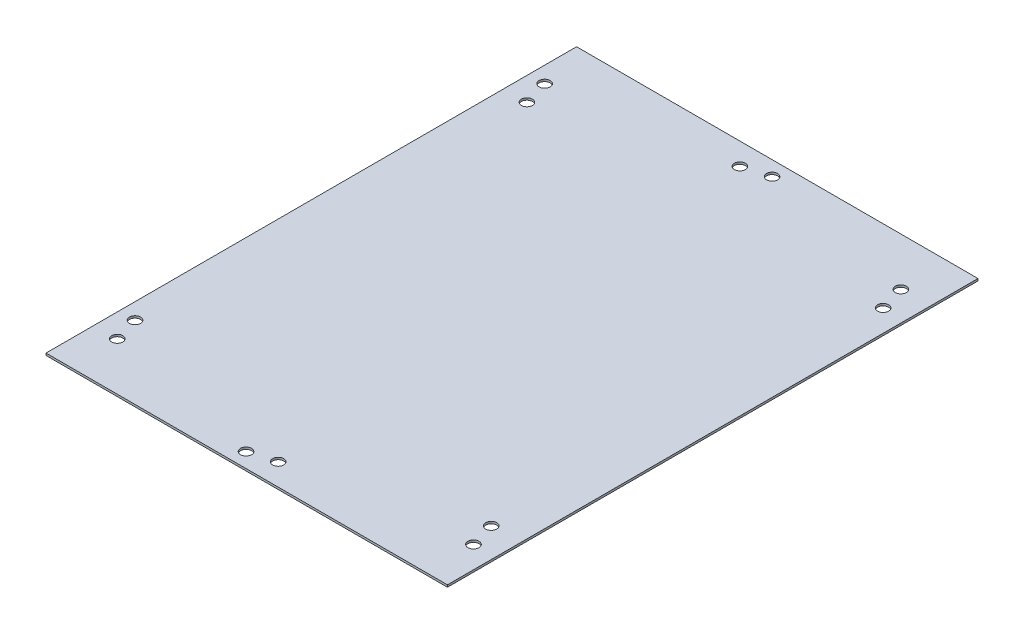
ISO-10303-21;
HEADER;
FILE_DESCRIPTION(('STEP AP214'),'2;1');
FILE_NAME('part.step','',(''),(''),'','','');
FILE_SCHEMA(('AUTOMOTIVE_DESIGN { 1 0 10303 214 1 1 1 1 }'));
ENDSEC;
DATA;
#1=APPLICATION_CONTEXT('core data for automotive mechanical design processes');
#2=APPLICATION_PROTOCOL_DEFINITION('international standard','automotive_design',2000,#1);
#3=PRODUCT_CONTEXT('',#1,'mechanical');
#4=PRODUCT('Part','Part','',(#3));
#5=PRODUCT_RELATED_PRODUCT_CATEGORY('part','',(#4));
#6=PRODUCT_DEFINITION_FORMATION('','',#4);
#7=PRODUCT_DEFINITION_CONTEXT('part definition',#1,'design');
#8=PRODUCT_DEFINITION('design','',#6,#7);
#9=PRODUCT_DEFINITION_SHAPE('','',#8);
#10=(LENGTH_UNIT() NAMED_UNIT(*) SI_UNIT(.MILLI.,.METRE.));
#11=(NAMED_UNIT(*) PLANE_ANGLE_UNIT() SI_UNIT($,.RADIAN.));
#12=(NAMED_UNIT(*) SI_UNIT($,.STERADIAN.) SOLID_ANGLE_UNIT());
#13=UNCERTAINTY_MEASURE_WITH_UNIT(LENGTH_MEASURE(1.E-05),#10,'distance_accuracy_value','');
#14=(GEOMETRIC_REPRESENTATION_CONTEXT(3) GLOBAL_UNCERTAINTY_ASSIGNED_CONTEXT((#13)) GLOBAL_UNIT_ASSIGNED_CONTEXT((#10,
#11,#12)) REPRESENTATION_CONTEXT('',''));
#15=CARTESIAN_POINT('',(0.,0.,0.));
#16=DIRECTION('',(0.,0.,1.));
#17=DIRECTION('',(1.,0.,0.));
#18=AXIS2_PLACEMENT_3D('',#15,#16,#17);
#19=CARTESIAN_POINT('',(122.5,1.2954,-161.9));
#20=DIRECTION('',(-1.,0.,0.));
#21=DIRECTION('',(0.,0.,1.));
#22=AXIS2_PLACEMENT_3D('',#19,#20,#21);
#23=PLANE('',#22);
#24=DIRECTION('',(0.,0.,-1.));
#25=VECTOR('',#24,1.);
#26=CARTESIAN_POINT('',(122.5,0.,-161.9));
#27=LINE('',#26,#25);
#28=CARTESIAN_POINT('',(122.5,0.,161.9));
#29=VERTEX_POINT('',#28);
#30=CARTESIAN_POINT('',(122.5,0.,-161.9));
#31=VERTEX_POINT('',#30);
#32=EDGE_CURVE('E96',#29,#31,#27,.T.);
#33=ORIENTED_EDGE('',*,*,#32,.T.);
#34=DIRECTION('',(0.,-1.,0.));
#35=VECTOR('',#34,1.);
#36=CARTESIAN_POINT('',(122.5,1.2954,-161.9));
#37=LINE('',#36,#35);
#38=CARTESIAN_POINT('',(122.5,1.2954,-161.9));
#39=VERTEX_POINT('',#38);
#40=EDGE_CURVE('E11',#39,#31,#37,.T.);
#41=ORIENTED_EDGE('',*,*,#40,.F.);
#42=DIRECTION('',(0.,0.,-1.));
#43=VECTOR('',#42,1.);
#44=CARTESIAN_POINT('',(122.5,1.2954,-161.9));
#45=LINE('',#44,#43);
#46=CARTESIAN_POINT('',(122.5,1.2954,161.9));
#47=VERTEX_POINT('',#46);
#48=EDGE_CURVE('E84',#47,#39,#45,.T.);
#49=ORIENTED_EDGE('',*,*,#48,.F.);
#50=DIRECTION('',(0.,-1.,0.));
#51=VECTOR('',#50,1.);
#52=CARTESIAN_POINT('',(122.5,1.2954,161.9));
#53=LINE('',#52,#51);
#54=EDGE_CURVE('E92',#47,#29,#53,.T.);
#55=ORIENTED_EDGE('',*,*,#54,.T.);
#56=EDGE_LOOP('',(#33,#41,#49,#55));
#57=FACE_BOUND('',#56,.T.);
#58=ADVANCED_FACE('F33',(#57),#23,.F.);
#59=CARTESIAN_POINT('',(-122.5,1.2954,-161.9));
#60=DIRECTION('',(0.,0.,1.));
#61=DIRECTION('',(1.,0.,0.));
#62=AXIS2_PLACEMENT_3D('',#59,#60,#61);
#63=PLANE('',#62);
#64=DIRECTION('',(-1.,0.,0.));
#65=VECTOR('',#64,1.);
#66=CARTESIAN_POINT('',(-122.5,0.,-161.9));
#67=LINE('',#66,#65);
#68=CARTESIAN_POINT('',(-122.5,0.,-161.9));
#69=VERTEX_POINT('',#68);
#70=EDGE_CURVE('E88',#31,#69,#67,.T.);
#71=ORIENTED_EDGE('',*,*,#70,.T.);
#72=DIRECTION('',(0.,-1.,0.));
#73=VECTOR('',#72,1.);
#74=CARTESIAN_POINT('',(-122.5,1.2954,-161.9));
#75=LINE('',#74,#73);
#76=CARTESIAN_POINT('',(-122.5,1.2954,-161.9));
#77=VERTEX_POINT('',#76);
#78=EDGE_CURVE('E41',#77,#69,#75,.T.);
#79=ORIENTED_EDGE('',*,*,#78,.F.);
#80=DIRECTION('',(-1.,0.,0.));
#81=VECTOR('',#80,1.);
#82=CARTESIAN_POINT('',(-122.5,1.2954,-161.9));
#83=LINE('',#82,#81);
#84=EDGE_CURVE('E79',#39,#77,#83,.T.);
#85=ORIENTED_EDGE('',*,*,#84,.F.);
#86=ORIENTED_EDGE('',*,*,#40,.T.);
#87=EDGE_LOOP('',(#71,#79,#85,#86));
#88=FACE_BOUND('',#87,.T.);
#89=ADVANCED_FACE('F87',(#88),#63,.F.);
#90=CARTESIAN_POINT('',(-122.5,1.2954,-161.9));
#91=DIRECTION('',(1.,0.,0.));
#92=DIRECTION('',(0.,0.,-1.));
#93=AXIS2_PLACEMENT_3D('',#90,#91,#92);
#94=PLANE('',#93);
#95=DIRECTION('',(0.,0.,1.));
#96=VECTOR('',#95,1.);
#97=CARTESIAN_POINT('',(-122.5,0.,-161.9));
#98=LINE('',#97,#96);
#99=CARTESIAN_POINT('',(-122.5,0.,161.9));
#100=VERTEX_POINT('',#99);
#101=EDGE_CURVE('E66',#69,#100,#98,.T.);
#102=ORIENTED_EDGE('',*,*,#101,.T.);
#103=DIRECTION('',(0.,-1.,0.));
#104=VECTOR('',#103,1.);
#105=CARTESIAN_POINT('',(-122.5,1.2954,161.9));
#106=LINE('',#105,#104);
#107=CARTESIAN_POINT('',(-122.5,1.2954,161.9));
#108=VERTEX_POINT('',#107);
#109=EDGE_CURVE('E89',#108,#100,#106,.T.);
#110=ORIENTED_EDGE('',*,*,#109,.F.);
#111=DIRECTION('',(0.,0.,1.));
#112=VECTOR('',#111,1.);
#113=CARTESIAN_POINT('',(-122.5,1.2954,-161.9));
#114=LINE('',#113,#112);
#115=EDGE_CURVE('E82',#77,#108,#114,.T.);
#116=ORIENTED_EDGE('',*,*,#115,.F.);
#117=ORIENTED_EDGE('',*,*,#78,.T.);
#118=EDGE_LOOP('',(#102,#110,#116,#117));
#119=FACE_BOUND('',#118,.T.);
#120=ADVANCED_FACE('F90',(#119),#94,.F.);
#121=CARTESIAN_POINT('',(-122.5,1.2954,161.9));
#122=DIRECTION('',(0.,0.,-1.));
#123=DIRECTION('',(-1.,0.,0.));
#124=AXIS2_PLACEMENT_3D('',#121,#122,#123);
#125=PLANE('',#124);
#126=DIRECTION('',(1.,0.,0.));
#127=VECTOR('',#126,1.);
#128=CARTESIAN_POINT('',(-122.5,0.,161.9));
#129=LINE('',#128,#127);
#130=EDGE_CURVE('E72',#100,#29,#129,.T.);
#131=ORIENTED_EDGE('',*,*,#130,.T.);
#132=ORIENTED_EDGE('',*,*,#54,.F.);
#133=DIRECTION('',(1.,0.,0.));
#134=VECTOR('',#133,1.);
#135=CARTESIAN_POINT('',(-122.5,1.2954,161.9));
#136=LINE('',#135,#134);
#137=EDGE_CURVE('E49',#108,#47,#136,.T.);
#138=ORIENTED_EDGE('',*,*,#137,.F.);
#139=ORIENTED_EDGE('',*,*,#109,.T.);
#140=EDGE_LOOP('',(#131,#132,#138,#139));
#141=FACE_BOUND('',#140,.T.);
#142=ADVANCED_FACE('F104',(#141),#125,.F.);
#143=CARTESIAN_POINT('',(0.,1.2954,0.));
#144=DIRECTION('',(0.,1.,0.));
#145=DIRECTION('',(0.,0.,1.));
#146=AXIS2_PLACEMENT_3D('',#143,#144,#145);
#147=PLANE('',#146);
#148=CARTESIAN_POINT('',(-108.2954,1.2954,-117.379999999997));
#149=DIRECTION('',(0.,1.,0.));
#150=DIRECTION('',(0.,0.,1.));
#151=AXIS2_PLACEMENT_3D('',#148,#149,#150);
#152=CIRCLE('',#151,3.37819999999998);
#153=CARTESIAN_POINT('',(-108.2954,1.2954,-114.001799999997));
#154=VERTEX_POINT('',#153);
#155=EDGE_CURVE('E144',#154,#154,#152,.T.);
#156=ORIENTED_EDGE('',*,*,#155,.F.);
#157=EDGE_LOOP('',(#156));
#158=FACE_BOUND('',#157,.T.);
#159=CARTESIAN_POINT('',(-9.41540000000002,1.2954,-148.500000000001));
#160=DIRECTION('',(0.,1.,0.));
#161=DIRECTION('',(0.,0.,1.));
#162=AXIS2_PLACEMENT_3D('',#159,#160,#161);
#163=CIRCLE('',#162,3.37819999999999);
#164=CARTESIAN_POINT('',(-9.41540000000002,1.2954,-145.121800000001));
#165=VERTEX_POINT('',#164);
#166=EDGE_CURVE('E143',#165,#165,#163,.T.);
#167=ORIENTED_EDGE('',*,*,#166,.F.);
#168=EDGE_LOOP('',(#167));
#169=FACE_BOUND('',#168,.T.);
#170=CARTESIAN_POINT('',(5.82459999999998,1.2954,-152.900000000001));
#171=DIRECTION('',(0.,1.,0.));
#172=DIRECTION('',(0.,0.,1.));
#173=AXIS2_PLACEMENT_3D('',#170,#171,#172);
#174=CIRCLE('',#173,3.37819999999999);
#175=CARTESIAN_POINT('',(5.82459999999998,1.2954,-149.521800000001));
#176=VERTEX_POINT('',#175);
#177=EDGE_CURVE('E151',#176,#176,#174,.T.);
#178=ORIENTED_EDGE('',*,*,#177,.F.);
#179=EDGE_LOOP('',(#178));
#180=FACE_BOUND('',#179,.T.);
#181=CARTESIAN_POINT('',(104.7046,1.2954,-132.619999999997));
#182=DIRECTION('',(0.,1.,0.));
#183=DIRECTION('',(0.,0.,1.));
#184=AXIS2_PLACEMENT_3D('',#181,#182,#183);
#185=CIRCLE('',#184,3.37819999999998);
#186=CARTESIAN_POINT('',(104.7046,1.2954,-129.241799999997));
#187=VERTEX_POINT('',#186);
#188=EDGE_CURVE('E157',#187,#187,#185,.T.);
#189=ORIENTED_EDGE('',*,*,#188,.F.);
#190=EDGE_LOOP('',(#189));
#191=FACE_BOUND('',#190,.T.);
#192=CARTESIAN_POINT('',(104.7046,1.2954,117.380000000003));
#193=DIRECTION('',(0.,1.,0.));
#194=DIRECTION('',(0.,0.,1.));
#195=AXIS2_PLACEMENT_3D('',#192,#193,#194);
#196=CIRCLE('',#195,3.37820000000001);
#197=CARTESIAN_POINT('',(104.7046,1.2954,120.758200000003));
#198=VERTEX_POINT('',#197);
#199=EDGE_CURVE('E119',#198,#198,#196,.T.);
#200=ORIENTED_EDGE('',*,*,#199,.F.);
#201=EDGE_LOOP('',(#200));
#202=FACE_BOUND('',#201,.T.);
#203=CARTESIAN_POINT('',(5.82459999999997,1.2954,148.499999999999));
#204=DIRECTION('',(0.,1.,0.));
#205=DIRECTION('',(0.,0.,1.));
#206=AXIS2_PLACEMENT_3D('',#203,#204,#205);
#207=CIRCLE('',#206,3.37819999999998);
#208=CARTESIAN_POINT('',(5.82459999999997,1.2954,151.878199999999));
#209=VERTEX_POINT('',#208);
#210=EDGE_CURVE('E120',#209,#209,#207,.T.);
#211=ORIENTED_EDGE('',*,*,#210,.F.);
#212=EDGE_LOOP('',(#211));
#213=FACE_BOUND('',#212,.T.);
#214=CARTESIAN_POINT('',(-9.41540000000003,1.2954,152.899999999999));
#215=DIRECTION('',(0.,1.,0.));
#216=DIRECTION('',(0.,0.,1.));
#217=AXIS2_PLACEMENT_3D('',#214,#215,#216);
#218=CIRCLE('',#217,3.37819999999999);
#219=CARTESIAN_POINT('',(-9.41540000000003,1.2954,156.278199999999));
#220=VERTEX_POINT('',#219);
#221=EDGE_CURVE('E131',#220,#220,#218,.T.);
#222=ORIENTED_EDGE('',*,*,#221,.F.);
#223=EDGE_LOOP('',(#222));
#224=FACE_BOUND('',#223,.T.);
#225=CARTESIAN_POINT('',(109.1046,1.2954,-117.379999999997));
#226=DIRECTION('',(0.,1.,0.));
#227=DIRECTION('',(0.,0.,1.));
#228=AXIS2_PLACEMENT_3D('',#225,#226,#227);
#229=CIRCLE('',#228,3.37819999999998);
#230=CARTESIAN_POINT('',(109.1046,1.2954,-114.001799999997));
#231=VERTEX_POINT('',#230);
#232=EDGE_CURVE('E132',#231,#231,#229,.T.);
#233=ORIENTED_EDGE('',*,*,#232,.F.);
#234=EDGE_LOOP('',(#233));
#235=FACE_BOUND('',#234,.T.);
#236=CARTESIAN_POINT('',(-112.6954,1.2954,117.380000000003));
#237=DIRECTION('',(0.,1.,0.));
#238=DIRECTION('',(0.,0.,1.));
#239=AXIS2_PLACEMENT_3D('',#236,#237,#238);
#240=CIRCLE('',#239,3.37819999999999);
#241=CARTESIAN_POINT('',(-112.6954,1.2954,120.758200000003));
#242=VERTEX_POINT('',#241);
#243=EDGE_CURVE('E178',#242,#242,#240,.T.);
#244=ORIENTED_EDGE('',*,*,#243,.F.);
#245=EDGE_LOOP('',(#244));
#246=FACE_BOUND('',#245,.T.);
#247=CARTESIAN_POINT('',(-108.2954,1.2954,132.620000000003));
#248=DIRECTION('',(0.,1.,0.));
#249=DIRECTION('',(0.,0.,1.));
#250=AXIS2_PLACEMENT_3D('',#247,#248,#249);
#251=CIRCLE('',#250,3.37819999999995);
#252=CARTESIAN_POINT('',(-108.2954,1.2954,135.998200000003));
#253=VERTEX_POINT('',#252);
#254=EDGE_CURVE('E168',#253,#253,#251,.T.);
#255=ORIENTED_EDGE('',*,*,#254,.F.);
#256=EDGE_LOOP('',(#255));
#257=FACE_BOUND('',#256,.T.);
#258=CARTESIAN_POINT('',(-112.6954,1.2954,-132.619999999997));
#259=DIRECTION('',(0.,1.,0.));
#260=DIRECTION('',(0.,0.,1.));
#261=AXIS2_PLACEMENT_3D('',#258,#259,#260);
#262=CIRCLE('',#261,3.37819999999998);
#263=CARTESIAN_POINT('',(-112.6954,1.2954,-129.241799999997));
#264=VERTEX_POINT('',#263);
#265=EDGE_CURVE('E167',#264,#264,#262,.T.);
#266=ORIENTED_EDGE('',*,*,#265,.F.);
#267=EDGE_LOOP('',(#266));
#268=FACE_BOUND('',#267,.T.);
#269=CARTESIAN_POINT('',(109.1046,1.2954,132.620000000003));
#270=DIRECTION('',(0.,1.,0.));
#271=DIRECTION('',(0.,0.,1.));
#272=AXIS2_PLACEMENT_3D('',#269,#270,#271);
#273=CIRCLE('',#272,3.37819999999999);
#274=CARTESIAN_POINT('',(109.1046,1.2954,135.998200000003));
#275=VERTEX_POINT('',#274);
#276=EDGE_CURVE('E112',#275,#275,#273,.T.);
#277=ORIENTED_EDGE('',*,*,#276,.F.);
#278=EDGE_LOOP('',(#277));
#279=FACE_BOUND('',#278,.T.);
#280=ORIENTED_EDGE('',*,*,#48,.T.);
#281=ORIENTED_EDGE('',*,*,#84,.T.);
#282=ORIENTED_EDGE('',*,*,#115,.T.);
#283=ORIENTED_EDGE('',*,*,#137,.T.);
#284=EDGE_LOOP('',(#280,#281,#282,#283));
#285=FACE_BOUND('',#284,.T.);
#286=ADVANCED_FACE('F80',(#158,#169,#180,#191,#202,#213,#224,#235,#246,#257,#268,#279,#285),
#147,.T.);
#287=CARTESIAN_POINT('',(0.,0.,0.));
#288=DIRECTION('',(0.,1.,0.));
#289=DIRECTION('',(0.,0.,1.));
#290=AXIS2_PLACEMENT_3D('',#287,#288,#289);
#291=PLANE('',#290);
#292=CARTESIAN_POINT('',(-108.2954,0.,-117.379999999997));
#293=DIRECTION('',(0.,1.,0.));
#294=DIRECTION('',(0.,0.,1.));
#295=AXIS2_PLACEMENT_3D('',#292,#293,#294);
#296=CIRCLE('',#295,3.37819999999998);
#297=CARTESIAN_POINT('',(-108.2954,0.,-114.001799999997));
#298=VERTEX_POINT('',#297);
#299=EDGE_CURVE('E140',#298,#298,#296,.F.);
#300=ORIENTED_EDGE('',*,*,#299,.F.);
#301=EDGE_LOOP('',(#300));
#302=FACE_BOUND('',#301,.T.);
#303=CARTESIAN_POINT('',(-9.41540000000002,0.,-148.500000000001));
#304=DIRECTION('',(0.,1.,0.));
#305=DIRECTION('',(0.,0.,1.));
#306=AXIS2_PLACEMENT_3D('',#303,#304,#305);
#307=CIRCLE('',#306,3.37819999999999);
#308=CARTESIAN_POINT('',(-9.41540000000002,0.,-145.121800000001));
#309=VERTEX_POINT('',#308);
#310=EDGE_CURVE('E148',#309,#309,#307,.F.);
#311=ORIENTED_EDGE('',*,*,#310,.F.);
#312=EDGE_LOOP('',(#311));
#313=FACE_BOUND('',#312,.T.);
#314=CARTESIAN_POINT('',(5.82459999999998,0.,-152.900000000001));
#315=DIRECTION('',(0.,1.,0.));
#316=DIRECTION('',(0.,0.,1.));
#317=AXIS2_PLACEMENT_3D('',#314,#315,#316);
#318=CIRCLE('',#317,3.37819999999999);
#319=CARTESIAN_POINT('',(5.82459999999998,0.,-149.521800000001));
#320=VERTEX_POINT('',#319);
#321=EDGE_CURVE('E154',#320,#320,#318,.F.);
#322=ORIENTED_EDGE('',*,*,#321,.F.);
#323=EDGE_LOOP('',(#322));
#324=FACE_BOUND('',#323,.T.);
#325=CARTESIAN_POINT('',(104.7046,0.,-132.619999999997));
#326=DIRECTION('',(0.,1.,0.));
#327=DIRECTION('',(0.,0.,1.));
#328=AXIS2_PLACEMENT_3D('',#325,#326,#327);
#329=CIRCLE('',#328,3.37819999999998);
#330=CARTESIAN_POINT('',(104.7046,0.,-129.241799999997));
#331=VERTEX_POINT('',#330);
#332=EDGE_CURVE('E135',#331,#331,#329,.F.);
#333=ORIENTED_EDGE('',*,*,#332,.F.);
#334=EDGE_LOOP('',(#333));
#335=FACE_BOUND('',#334,.T.);
#336=CARTESIAN_POINT('',(104.7046,0.,117.380000000003));
#337=DIRECTION('',(0.,1.,0.));
#338=DIRECTION('',(0.,0.,1.));
#339=AXIS2_PLACEMENT_3D('',#336,#337,#338);
#340=CIRCLE('',#339,3.37820000000001);
#341=CARTESIAN_POINT('',(104.7046,0.,120.758200000003));
#342=VERTEX_POINT('',#341);
#343=EDGE_CURVE('E115',#342,#342,#340,.F.);
#344=ORIENTED_EDGE('',*,*,#343,.F.);
#345=EDGE_LOOP('',(#344));
#346=FACE_BOUND('',#345,.T.);
#347=CARTESIAN_POINT('',(5.82459999999997,0.,148.499999999999));
#348=DIRECTION('',(0.,1.,0.));
#349=DIRECTION('',(0.,0.,1.));
#350=AXIS2_PLACEMENT_3D('',#347,#348,#349);
#351=CIRCLE('',#350,3.37819999999998);
#352=CARTESIAN_POINT('',(5.82459999999997,0.,151.878199999999));
#353=VERTEX_POINT('',#352);
#354=EDGE_CURVE('E116',#353,#353,#351,.F.);
#355=ORIENTED_EDGE('',*,*,#354,.F.);
#356=EDGE_LOOP('',(#355));
#357=FACE_BOUND('',#356,.T.);
#358=CARTESIAN_POINT('',(-9.41540000000003,0.,152.899999999999));
#359=DIRECTION('',(0.,1.,0.));
#360=DIRECTION('',(0.,0.,1.));
#361=AXIS2_PLACEMENT_3D('',#358,#359,#360);
#362=CIRCLE('',#361,3.37819999999999);
#363=CARTESIAN_POINT('',(-9.41540000000003,0.,156.278199999999));
#364=VERTEX_POINT('',#363);
#365=EDGE_CURVE('E123',#364,#364,#362,.F.);
#366=ORIENTED_EDGE('',*,*,#365,.F.);
#367=EDGE_LOOP('',(#366));
#368=FACE_BOUND('',#367,.T.);
#369=CARTESIAN_POINT('',(109.1046,0.,-117.379999999997));
#370=DIRECTION('',(0.,1.,0.));
#371=DIRECTION('',(0.,0.,1.));
#372=AXIS2_PLACEMENT_3D('',#369,#370,#371);
#373=CIRCLE('',#372,3.37819999999998);
#374=CARTESIAN_POINT('',(109.1046,0.,-114.001799999997));
#375=VERTEX_POINT('',#374);
#376=EDGE_CURVE('E128',#375,#375,#373,.F.);
#377=ORIENTED_EDGE('',*,*,#376,.F.);
#378=EDGE_LOOP('',(#377));
#379=FACE_BOUND('',#378,.T.);
#380=CARTESIAN_POINT('',(-112.6954,0.,117.380000000003));
#381=DIRECTION('',(0.,1.,0.));
#382=DIRECTION('',(0.,0.,1.));
#383=AXIS2_PLACEMENT_3D('',#380,#381,#382);
#384=CIRCLE('',#383,3.37819999999999);
#385=CARTESIAN_POINT('',(-112.6954,0.,120.758200000003));
#386=VERTEX_POINT('',#385);
#387=EDGE_CURVE('E171',#386,#386,#384,.F.);
#388=ORIENTED_EDGE('',*,*,#387,.F.);
#389=EDGE_LOOP('',(#388));
#390=FACE_BOUND('',#389,.T.);
#391=CARTESIAN_POINT('',(-108.2954,0.,132.620000000003));
#392=DIRECTION('',(0.,1.,0.));
#393=DIRECTION('',(0.,0.,1.));
#394=AXIS2_PLACEMENT_3D('',#391,#392,#393);
#395=CIRCLE('',#394,3.37819999999995);
#396=CARTESIAN_POINT('',(-108.2954,0.,135.998200000003));
#397=VERTEX_POINT('',#396);
#398=EDGE_CURVE('E164',#397,#397,#395,.F.);
#399=ORIENTED_EDGE('',*,*,#398,.F.);
#400=EDGE_LOOP('',(#399));
#401=FACE_BOUND('',#400,.T.);
#402=CARTESIAN_POINT('',(-112.6954,0.,-132.619999999997));
#403=DIRECTION('',(0.,1.,0.));
#404=DIRECTION('',(0.,0.,1.));
#405=AXIS2_PLACEMENT_3D('',#402,#403,#404);
#406=CIRCLE('',#405,3.37819999999998);
#407=CARTESIAN_POINT('',(-112.6954,0.,-129.241799999997));
#408=VERTEX_POINT('',#407);
#409=EDGE_CURVE('E147',#408,#408,#406,.F.);
#410=ORIENTED_EDGE('',*,*,#409,.F.);
#411=EDGE_LOOP('',(#410));
#412=FACE_BOUND('',#411,.T.);
#413=CARTESIAN_POINT('',(109.1046,0.,132.620000000003));
#414=DIRECTION('',(0.,1.,0.));
#415=DIRECTION('',(0.,0.,1.));
#416=AXIS2_PLACEMENT_3D('',#413,#414,#415);
#417=CIRCLE('',#416,3.37819999999999);
#418=CARTESIAN_POINT('',(109.1046,0.,135.998200000003));
#419=VERTEX_POINT('',#418);
#420=EDGE_CURVE('E99',#419,#419,#417,.F.);
#421=ORIENTED_EDGE('',*,*,#420,.F.);
#422=EDGE_LOOP('',(#421));
#423=FACE_BOUND('',#422,.T.);
#424=ORIENTED_EDGE('',*,*,#32,.F.);
#425=ORIENTED_EDGE('',*,*,#130,.F.);
#426=ORIENTED_EDGE('',*,*,#101,.F.);
#427=ORIENTED_EDGE('',*,*,#70,.F.);
#428=EDGE_LOOP('',(#424,#425,#426,#427));
#429=FACE_BOUND('',#428,.T.);
#430=ADVANCED_FACE('F107',(#302,#313,#324,#335,#346,#357,#368,#379,#390,#401,#412,#423,#429),
#291,.F.);
#431=CARTESIAN_POINT('',(109.1046,-0.000999999999999916,132.620000000003));
#432=DIRECTION('',(0.,1.,0.));
#433=DIRECTION('',(0.,0.,1.));
#434=AXIS2_PLACEMENT_3D('',#431,#432,#433);
#435=CYLINDRICAL_SURFACE('',#434,3.37819999999999);
#436=ORIENTED_EDGE('',*,*,#276,.T.);
#437=EDGE_LOOP('',(#436));
#438=FACE_BOUND('',#437,.T.);
#439=ORIENTED_EDGE('',*,*,#420,.T.);
#440=EDGE_LOOP('',(#439));
#441=FACE_BOUND('',#440,.T.);
#442=ADVANCED_FACE('F195',(#438,#441),#435,.F.);
#443=CARTESIAN_POINT('',(-112.6954,-0.000999999999999916,-132.619999999997));
#444=DIRECTION('',(0.,1.,0.));
#445=DIRECTION('',(0.,0.,1.));
#446=AXIS2_PLACEMENT_3D('',#443,#444,#445);
#447=CYLINDRICAL_SURFACE('',#446,3.37819999999998);
#448=ORIENTED_EDGE('',*,*,#265,.T.);
#449=EDGE_LOOP('',(#448));
#450=FACE_BOUND('',#449,.T.);
#451=ORIENTED_EDGE('',*,*,#409,.T.);
#452=EDGE_LOOP('',(#451));
#453=FACE_BOUND('',#452,.T.);
#454=ADVANCED_FACE('F198',(#450,#453),#447,.F.);
#455=CARTESIAN_POINT('',(-108.2954,-0.000999999999999916,132.620000000003));
#456=DIRECTION('',(0.,1.,0.));
#457=DIRECTION('',(0.,0.,1.));
#458=AXIS2_PLACEMENT_3D('',#455,#456,#457);
#459=CYLINDRICAL_SURFACE('',#458,3.37819999999995);
#460=ORIENTED_EDGE('',*,*,#254,.T.);
#461=EDGE_LOOP('',(#460));
#462=FACE_BOUND('',#461,.T.);
#463=ORIENTED_EDGE('',*,*,#398,.T.);
#464=EDGE_LOOP('',(#463));
#465=FACE_BOUND('',#464,.T.);
#466=ADVANCED_FACE('F243',(#462,#465),#459,.F.);
#467=CARTESIAN_POINT('',(-112.6954,-0.000999999999999916,117.380000000003));
#468=DIRECTION('',(0.,1.,0.));
#469=DIRECTION('',(0.,0.,1.));
#470=AXIS2_PLACEMENT_3D('',#467,#468,#469);
#471=CYLINDRICAL_SURFACE('',#470,3.37819999999999);
#472=ORIENTED_EDGE('',*,*,#243,.T.);
#473=EDGE_LOOP('',(#472));
#474=FACE_BOUND('',#473,.T.);
#475=ORIENTED_EDGE('',*,*,#387,.T.);
#476=EDGE_LOOP('',(#475));
#477=FACE_BOUND('',#476,.T.);
#478=ADVANCED_FACE('F182',(#474,#477),#471,.F.);
#479=CARTESIAN_POINT('',(109.1046,-0.000999999999999916,-117.379999999997));
#480=DIRECTION('',(0.,1.,0.));
#481=DIRECTION('',(0.,0.,1.));
#482=AXIS2_PLACEMENT_3D('',#479,#480,#481);
#483=CYLINDRICAL_SURFACE('',#482,3.37819999999998);
#484=ORIENTED_EDGE('',*,*,#232,.T.);
#485=EDGE_LOOP('',(#484));
#486=FACE_BOUND('',#485,.T.);
#487=ORIENTED_EDGE('',*,*,#376,.T.);
#488=EDGE_LOOP('',(#487));
#489=FACE_BOUND('',#488,.T.);
#490=ADVANCED_FACE('F258',(#486,#489),#483,.F.);
#491=CARTESIAN_POINT('',(-9.41540000000003,-0.000999999999999916,152.899999999999));
#492=DIRECTION('',(0.,1.,0.));
#493=DIRECTION('',(0.,0.,1.));
#494=AXIS2_PLACEMENT_3D('',#491,#492,#493);
#495=CYLINDRICAL_SURFACE('',#494,3.37819999999999);
#496=ORIENTED_EDGE('',*,*,#221,.T.);
#497=EDGE_LOOP('',(#496));
#498=FACE_BOUND('',#497,.T.);
#499=ORIENTED_EDGE('',*,*,#365,.T.);
#500=EDGE_LOOP('',(#499));
#501=FACE_BOUND('',#500,.T.);
#502=ADVANCED_FACE('F265',(#498,#501),#495,.F.);
#503=CARTESIAN_POINT('',(5.82459999999997,-0.000999999999999916,148.499999999999));
#504=DIRECTION('',(0.,1.,0.));
#505=DIRECTION('',(0.,0.,1.));
#506=AXIS2_PLACEMENT_3D('',#503,#504,#505);
#507=CYLINDRICAL_SURFACE('',#506,3.37819999999998);
#508=ORIENTED_EDGE('',*,*,#210,.T.);
#509=EDGE_LOOP('',(#508));
#510=FACE_BOUND('',#509,.T.);
#511=ORIENTED_EDGE('',*,*,#354,.T.);
#512=EDGE_LOOP('',(#511));
#513=FACE_BOUND('',#512,.T.);
#514=ADVANCED_FACE('F273',(#510,#513),#507,.F.);
#515=CARTESIAN_POINT('',(104.7046,-0.000999999999999916,117.380000000003));
#516=DIRECTION('',(0.,1.,0.));
#517=DIRECTION('',(0.,0.,1.));
#518=AXIS2_PLACEMENT_3D('',#515,#516,#517);
#519=CYLINDRICAL_SURFACE('',#518,3.37820000000001);
#520=ORIENTED_EDGE('',*,*,#199,.T.);
#521=EDGE_LOOP('',(#520));
#522=FACE_BOUND('',#521,.T.);
#523=ORIENTED_EDGE('',*,*,#343,.T.);
#524=EDGE_LOOP('',(#523));
#525=FACE_BOUND('',#524,.T.);
#526=ADVANCED_FACE('F281',(#522,#525),#519,.F.);
#527=CARTESIAN_POINT('',(104.7046,-0.000999999999999916,-132.619999999997));
#528=DIRECTION('',(0.,1.,0.));
#529=DIRECTION('',(0.,0.,1.));
#530=AXIS2_PLACEMENT_3D('',#527,#528,#529);
#531=CYLINDRICAL_SURFACE('',#530,3.37819999999998);
#532=ORIENTED_EDGE('',*,*,#188,.T.);
#533=EDGE_LOOP('',(#532));
#534=FACE_BOUND('',#533,.T.);
#535=ORIENTED_EDGE('',*,*,#332,.T.);
#536=EDGE_LOOP('',(#535));
#537=FACE_BOUND('',#536,.T.);
#538=ADVANCED_FACE('F289',(#534,#537),#531,.F.);
#539=CARTESIAN_POINT('',(5.82459999999998,-0.000999999999999916,-152.900000000001));
#540=DIRECTION('',(0.,1.,0.));
#541=DIRECTION('',(0.,0.,1.));
#542=AXIS2_PLACEMENT_3D('',#539,#540,#541);
#543=CYLINDRICAL_SURFACE('',#542,3.37819999999999);
#544=ORIENTED_EDGE('',*,*,#177,.T.);
#545=EDGE_LOOP('',(#544));
#546=FACE_BOUND('',#545,.T.);
#547=ORIENTED_EDGE('',*,*,#321,.T.);
#548=EDGE_LOOP('',(#547));
#549=FACE_BOUND('',#548,.T.);
#550=ADVANCED_FACE('F297',(#546,#549),#543,.F.);
#551=CARTESIAN_POINT('',(-9.41540000000002,-0.000999999999999916,-148.500000000001));
#552=DIRECTION('',(0.,1.,0.));
#553=DIRECTION('',(0.,0.,1.));
#554=AXIS2_PLACEMENT_3D('',#551,#552,#553);
#555=CYLINDRICAL_SURFACE('',#554,3.37819999999999);
#556=ORIENTED_EDGE('',*,*,#166,.T.);
#557=EDGE_LOOP('',(#556));
#558=FACE_BOUND('',#557,.T.);
#559=ORIENTED_EDGE('',*,*,#310,.T.);
#560=EDGE_LOOP('',(#559));
#561=FACE_BOUND('',#560,.T.);
#562=ADVANCED_FACE('F305',(#558,#561),#555,.F.);
#563=CARTESIAN_POINT('',(-108.2954,-0.000999999999999916,-117.379999999997));
#564=DIRECTION('',(0.,1.,0.));
#565=DIRECTION('',(0.,0.,1.));
#566=AXIS2_PLACEMENT_3D('',#563,#564,#565);
#567=CYLINDRICAL_SURFACE('',#566,3.37819999999998);
#568=ORIENTED_EDGE('',*,*,#155,.T.);
#569=EDGE_LOOP('',(#568));
#570=FACE_BOUND('',#569,.T.);
#571=ORIENTED_EDGE('',*,*,#299,.T.);
#572=EDGE_LOOP('',(#571));
#573=FACE_BOUND('',#572,.T.);
#574=ADVANCED_FACE('F313',(#570,#573),#567,.F.);
#575=CLOSED_SHELL('',(#58,#89,#120,#142,#286,#430,#442,#454,#466,#478,#490,#502,#514,#526,#538,
#550,#562,#574));
#576=MANIFOLD_SOLID_BREP('B2',#575);
#577=ADVANCED_BREP_SHAPE_REPRESENTATION('',(#18,#576),#14);
#578=SHAPE_DEFINITION_REPRESENTATION(#9,#577);
ENDSEC;
END-ISO-10303-21;
